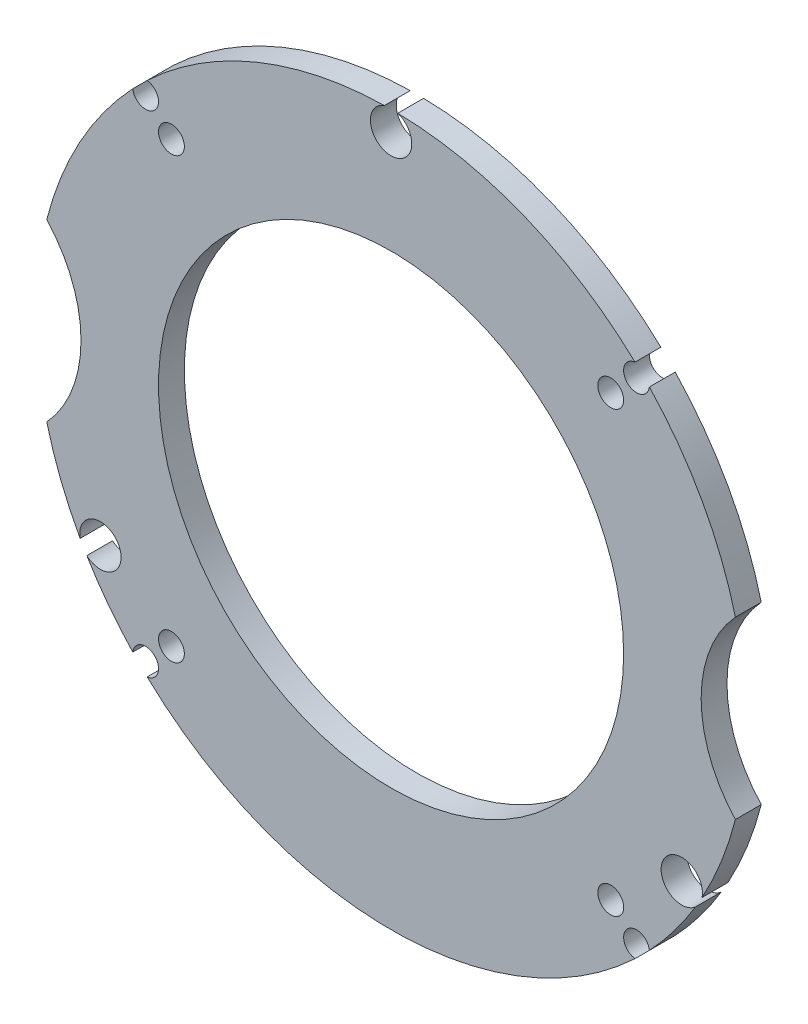
ISO-10303-21;
HEADER;
FILE_DESCRIPTION(('STEP AP214'),'2;1');
FILE_NAME('part.step','',(''),(''),'','','');
FILE_SCHEMA(('AUTOMOTIVE_DESIGN { 1 0 10303 214 1 1 1 1 }'));
ENDSEC;
DATA;
#1=APPLICATION_CONTEXT('core data for automotive mechanical design processes');
#2=APPLICATION_PROTOCOL_DEFINITION('international standard','automotive_design',2000,#1);
#3=PRODUCT_CONTEXT('',#1,'mechanical');
#4=PRODUCT('Part','Part','',(#3));
#5=PRODUCT_RELATED_PRODUCT_CATEGORY('part','',(#4));
#6=PRODUCT_DEFINITION_FORMATION('','',#4);
#7=PRODUCT_DEFINITION_CONTEXT('part definition',#1,'design');
#8=PRODUCT_DEFINITION('design','',#6,#7);
#9=PRODUCT_DEFINITION_SHAPE('','',#8);
#10=(LENGTH_UNIT() NAMED_UNIT(*) SI_UNIT(.MILLI.,.METRE.));
#11=(NAMED_UNIT(*) PLANE_ANGLE_UNIT() SI_UNIT($,.RADIAN.));
#12=(NAMED_UNIT(*) SI_UNIT($,.STERADIAN.) SOLID_ANGLE_UNIT());
#13=UNCERTAINTY_MEASURE_WITH_UNIT(LENGTH_MEASURE(1.E-05),#10,'distance_accuracy_value','');
#14=(GEOMETRIC_REPRESENTATION_CONTEXT(3) GLOBAL_UNCERTAINTY_ASSIGNED_CONTEXT((#13)) GLOBAL_UNIT_ASSIGNED_CONTEXT((#10,
#11,#12)) REPRESENTATION_CONTEXT('',''));
#15=CARTESIAN_POINT('',(0.,0.,0.));
#16=DIRECTION('',(0.,0.,1.));
#17=DIRECTION('',(1.,0.,0.));
#18=AXIS2_PLACEMENT_3D('',#15,#16,#17);
#19=CARTESIAN_POINT('',(0.,0.,2.));
#20=DIRECTION('',(0.,0.,-1.));
#21=DIRECTION('',(-1.,0.,0.));
#22=AXIS2_PLACEMENT_3D('',#19,#20,#21);
#23=CYLINDRICAL_SURFACE('',#22,27.5);
#24=DIRECTION('',(0.,0.,-1.));
#25=VECTOR('',#24,1.);
#26=CARTESIAN_POINT('',(26.6507352941176,-6.78146800352784,1.));
#27=LINE('',#26,#25);
#28=CARTESIAN_POINT('',(26.6507352941176,-6.78146800352784,2.));
#29=VERTEX_POINT('',#28);
#30=CARTESIAN_POINT('',(26.6507352941176,-6.78146800352783,0.));
#31=VERTEX_POINT('',#30);
#32=EDGE_CURVE('E48',#29,#31,#27,.T.);
#33=ORIENTED_EDGE('',*,*,#32,.F.);
#34=CARTESIAN_POINT('',(0.,0.,2.));
#35=DIRECTION('',(0.,0.,1.));
#36=DIRECTION('',(1.,0.,0.));
#37=AXIS2_PLACEMENT_3D('',#34,#35,#36);
#38=CIRCLE('',#37,27.5);
#39=CARTESIAN_POINT('',(24.0696780716224,-13.3003983973586,2.));
#40=VERTEX_POINT('',#39);
#41=EDGE_CURVE('E175',#40,#29,#38,.T.);
#42=ORIENTED_EDGE('',*,*,#41,.F.);
#43=DIRECTION('',(0.,0.,1.));
#44=VECTOR('',#43,1.);
#45=CARTESIAN_POINT('',(24.0696780716224,-13.3003983973586,1.));
#46=LINE('',#45,#44);
#47=CARTESIAN_POINT('',(24.0696780716224,-13.3003983973586,0.));
#48=VERTEX_POINT('',#47);
#49=EDGE_CURVE('E201',#40,#48,#46,.F.);
#50=ORIENTED_EDGE('',*,*,#49,.T.);
#51=CARTESIAN_POINT('',(0.,0.,0.));
#52=DIRECTION('',(0.,0.,1.));
#53=DIRECTION('',(1.,0.,0.));
#54=AXIS2_PLACEMENT_3D('',#51,#52,#53);
#55=CIRCLE('',#54,27.5);
#56=EDGE_CURVE('E214',#48,#31,#55,.T.);
#57=ORIENTED_EDGE('',*,*,#56,.T.);
#58=EDGE_LOOP('',(#33,#42,#50,#57));
#59=FACE_BOUND('',#58,.T.);
#60=ADVANCED_FACE('F33',(#59),#23,.T.);
#61=DIRECTION('',(0.,0.,-1.));
#62=VECTOR('',#61,1.);
#63=CARTESIAN_POINT('',(26.6507352941176,6.78146800352785,1.));
#64=LINE('',#63,#62);
#65=CARTESIAN_POINT('',(26.6507352941176,6.78146800352785,0.));
#66=VERTEX_POINT('',#65);
#67=CARTESIAN_POINT('',(26.6507352941176,6.78146800352785,2.));
#68=VERTEX_POINT('',#67);
#69=EDGE_CURVE('E155',#66,#68,#64,.F.);
#70=ORIENTED_EDGE('',*,*,#69,.F.);
#71=CARTESIAN_POINT('',(19.9930121510821,18.8819878489179,0.));
#72=VERTEX_POINT('',#71);
#73=EDGE_CURVE('E258',#66,#72,#55,.T.);
#74=ORIENTED_EDGE('',*,*,#73,.T.);
#75=DIRECTION('',(0.,0.,1.));
#76=VECTOR('',#75,1.);
#77=CARTESIAN_POINT('',(19.9930121510822,18.8819878489179,1.));
#78=LINE('',#77,#76);
#79=CARTESIAN_POINT('',(19.9930121510822,18.8819878489179,2.));
#80=VERTEX_POINT('',#79);
#81=EDGE_CURVE('E180',#72,#80,#78,.T.);
#82=ORIENTED_EDGE('',*,*,#81,.T.);
#83=EDGE_CURVE('E171',#68,#80,#38,.T.);
#84=ORIENTED_EDGE('',*,*,#83,.F.);
#85=EDGE_LOOP('',(#70,#74,#82,#84));
#86=FACE_BOUND('',#85,.T.);
#87=ADVANCED_FACE('F178',(#86),#23,.T.);
#88=DIRECTION('',(0.,0.,-1.));
#89=VECTOR('',#88,1.);
#90=CARTESIAN_POINT('',(-26.6507352941176,6.78146800352784,1.));
#91=LINE('',#90,#89);
#92=CARTESIAN_POINT('',(-26.6507352941176,6.78146800352784,2.));
#93=VERTEX_POINT('',#92);
#94=CARTESIAN_POINT('',(-26.6507352941176,6.78146800352784,0.));
#95=VERTEX_POINT('',#94);
#96=EDGE_CURVE('E55',#93,#95,#91,.T.);
#97=ORIENTED_EDGE('',*,*,#96,.F.);
#98=CARTESIAN_POINT('',(-19.9930121510822,18.8819878489179,2.));
#99=VERTEX_POINT('',#98);
#100=EDGE_CURVE('E187',#99,#93,#38,.T.);
#101=ORIENTED_EDGE('',*,*,#100,.F.);
#102=DIRECTION('',(0.,0.,1.));
#103=VECTOR('',#102,1.);
#104=CARTESIAN_POINT('',(-19.9930121510822,18.8819878489179,1.));
#105=LINE('',#104,#103);
#106=CARTESIAN_POINT('',(-19.9930121510822,18.8819878489179,0.));
#107=VERTEX_POINT('',#106);
#108=EDGE_CURVE('E340',#99,#107,#105,.F.);
#109=ORIENTED_EDGE('',*,*,#108,.T.);
#110=EDGE_CURVE('E247',#107,#95,#55,.T.);
#111=ORIENTED_EDGE('',*,*,#110,.T.);
#112=EDGE_LOOP('',(#97,#101,#109,#111));
#113=FACE_BOUND('',#112,.T.);
#114=ADVANCED_FACE('F353',(#113),#23,.T.);
#115=DIRECTION('',(0.,0.,-1.));
#116=VECTOR('',#115,1.);
#117=CARTESIAN_POINT('',(-26.6507352941176,-6.78146800352784,1.));
#118=LINE('',#117,#116);
#119=CARTESIAN_POINT('',(-26.6507352941176,-6.78146800352784,0.));
#120=VERTEX_POINT('',#119);
#121=CARTESIAN_POINT('',(-26.6507352941176,-6.78146800352784,2.));
#122=VERTEX_POINT('',#121);
#123=EDGE_CURVE('E345',#120,#122,#118,.F.);
#124=ORIENTED_EDGE('',*,*,#123,.F.);
#125=CARTESIAN_POINT('',(-24.0696780716224,-13.3003983973586,0.));
#126=VERTEX_POINT('',#125);
#127=EDGE_CURVE('E255',#120,#126,#55,.T.);
#128=ORIENTED_EDGE('',*,*,#127,.T.);
#129=DIRECTION('',(0.,0.,1.));
#130=VECTOR('',#129,1.);
#131=CARTESIAN_POINT('',(-24.0696780716224,-13.3003983973586,1.));
#132=LINE('',#131,#130);
#133=CARTESIAN_POINT('',(-24.0696780716224,-13.3003983973586,2.));
#134=VERTEX_POINT('',#133);
#135=EDGE_CURVE('E218',#126,#134,#132,.T.);
#136=ORIENTED_EDGE('',*,*,#135,.T.);
#137=EDGE_CURVE('E183',#122,#134,#38,.T.);
#138=ORIENTED_EDGE('',*,*,#137,.F.);
#139=EDGE_LOOP('',(#124,#128,#136,#138));
#140=FACE_BOUND('',#139,.T.);
#141=ADVANCED_FACE('F432',(#140),#23,.T.);
#142=CARTESIAN_POINT('',(-0.516356143244822,27.4951518696175,0.));
#143=VERTEX_POINT('',#142);
#144=CARTESIAN_POINT('',(-18.8819878489179,19.9930121510821,0.));
#145=VERTEX_POINT('',#144);
#146=EDGE_CURVE('E186',#143,#145,#55,.T.);
#147=ORIENTED_EDGE('',*,*,#146,.T.);
#148=DIRECTION('',(0.,0.,1.));
#149=VECTOR('',#148,1.);
#150=CARTESIAN_POINT('',(-18.8819878489179,19.9930121510822,1.));
#151=LINE('',#150,#149);
#152=CARTESIAN_POINT('',(-18.8819878489179,19.9930121510822,2.));
#153=VERTEX_POINT('',#152);
#154=EDGE_CURVE('E253',#145,#153,#151,.T.);
#155=ORIENTED_EDGE('',*,*,#154,.T.);
#156=CARTESIAN_POINT('',(-0.516356143244822,27.4951518696175,2.));
#157=VERTEX_POINT('',#156);
#158=EDGE_CURVE('E185',#157,#153,#38,.T.);
#159=ORIENTED_EDGE('',*,*,#158,.F.);
#160=DIRECTION('',(0.,0.,1.));
#161=VECTOR('',#160,1.);
#162=CARTESIAN_POINT('',(-0.516356143244816,27.4951518696176,1.));
#163=LINE('',#162,#161);
#164=EDGE_CURVE('E221',#157,#143,#163,.F.);
#165=ORIENTED_EDGE('',*,*,#164,.T.);
#166=EDGE_LOOP('',(#147,#155,#159,#165));
#167=FACE_BOUND('',#166,.T.);
#168=ADVANCED_FACE('F252',(#167),#23,.T.);
#169=CARTESIAN_POINT('',(-18.8819878489178,-19.9930121510822,0.));
#170=VERTEX_POINT('',#169);
#171=CARTESIAN_POINT('',(18.8819878489178,-19.9930121510822,0.));
#172=VERTEX_POINT('',#171);
#173=EDGE_CURVE('E260',#170,#172,#55,.T.);
#174=ORIENTED_EDGE('',*,*,#173,.T.);
#175=DIRECTION('',(0.,0.,1.));
#176=VECTOR('',#175,1.);
#177=CARTESIAN_POINT('',(18.8819878489179,-19.9930121510822,1.));
#178=LINE('',#177,#176);
#179=CARTESIAN_POINT('',(18.8819878489178,-19.9930121510822,2.));
#180=VERTEX_POINT('',#179);
#181=EDGE_CURVE('E236',#172,#180,#178,.T.);
#182=ORIENTED_EDGE('',*,*,#181,.T.);
#183=CARTESIAN_POINT('',(-18.8819878489178,-19.9930121510822,2.));
#184=VERTEX_POINT('',#183);
#185=EDGE_CURVE('E196',#184,#180,#38,.T.);
#186=ORIENTED_EDGE('',*,*,#185,.F.);
#187=DIRECTION('',(0.,0.,1.));
#188=VECTOR('',#187,1.);
#189=CARTESIAN_POINT('',(-18.8819878489179,-19.9930121510822,1.));
#190=LINE('',#189,#188);
#191=EDGE_CURVE('E227',#184,#170,#190,.F.);
#192=ORIENTED_EDGE('',*,*,#191,.T.);
#193=EDGE_LOOP('',(#174,#182,#186,#192));
#194=FACE_BOUND('',#193,.T.);
#195=ADVANCED_FACE('F387',(#194),#23,.T.);
#196=CARTESIAN_POINT('',(-23.5533219283776,-14.1947534722589,0.));
#197=VERTEX_POINT('',#196);
#198=CARTESIAN_POINT('',(-19.9930121510822,-18.8819878489178,0.));
#199=VERTEX_POINT('',#198);
#200=EDGE_CURVE('E254',#197,#199,#55,.T.);
#201=ORIENTED_EDGE('',*,*,#200,.T.);
#202=DIRECTION('',(0.,0.,1.));
#203=VECTOR('',#202,1.);
#204=CARTESIAN_POINT('',(-19.9930121510822,-18.8819878489179,1.));
#205=LINE('',#204,#203);
#206=CARTESIAN_POINT('',(-19.9930121510822,-18.8819878489178,2.));
#207=VERTEX_POINT('',#206);
#208=EDGE_CURVE('E230',#199,#207,#205,.T.);
#209=ORIENTED_EDGE('',*,*,#208,.T.);
#210=CARTESIAN_POINT('',(-23.5533219283776,-14.1947534722589,2.));
#211=VERTEX_POINT('',#210);
#212=EDGE_CURVE('E190',#211,#207,#38,.T.);
#213=ORIENTED_EDGE('',*,*,#212,.F.);
#214=DIRECTION('',(0.,0.,1.));
#215=VECTOR('',#214,1.);
#216=CARTESIAN_POINT('',(-23.5533219283776,-14.1947534722589,1.));
#217=LINE('',#216,#215);
#218=EDGE_CURVE('E212',#211,#197,#217,.F.);
#219=ORIENTED_EDGE('',*,*,#218,.T.);
#220=EDGE_LOOP('',(#201,#209,#213,#219));
#221=FACE_BOUND('',#220,.T.);
#222=ADVANCED_FACE('F381',(#221),#23,.T.);
#223=CARTESIAN_POINT('',(18.8819878489179,19.9930121510822,2.));
#224=VERTEX_POINT('',#223);
#225=CARTESIAN_POINT('',(0.516356143244828,27.4951518696175,2.));
#226=VERTEX_POINT('',#225);
#227=EDGE_CURVE('E181',#224,#226,#38,.T.);
#228=ORIENTED_EDGE('',*,*,#227,.F.);
#229=DIRECTION('',(0.,0.,1.));
#230=VECTOR('',#229,1.);
#231=CARTESIAN_POINT('',(18.8819878489179,19.9930121510822,1.));
#232=LINE('',#231,#230);
#233=CARTESIAN_POINT('',(18.8819878489179,19.9930121510822,0.));
#234=VERTEX_POINT('',#233);
#235=EDGE_CURVE('E320',#224,#234,#232,.F.);
#236=ORIENTED_EDGE('',*,*,#235,.T.);
#237=CARTESIAN_POINT('',(0.516356143244828,27.4951518696175,0.));
#238=VERTEX_POINT('',#237);
#239=EDGE_CURVE('E256',#234,#238,#55,.T.);
#240=ORIENTED_EDGE('',*,*,#239,.T.);
#241=DIRECTION('',(0.,0.,1.));
#242=VECTOR('',#241,1.);
#243=CARTESIAN_POINT('',(0.516356143244822,27.4951518696176,1.));
#244=LINE('',#243,#242);
#245=EDGE_CURVE('E224',#238,#226,#244,.T.);
#246=ORIENTED_EDGE('',*,*,#245,.T.);
#247=EDGE_LOOP('',(#228,#236,#240,#246));
#248=FACE_BOUND('',#247,.T.);
#249=ADVANCED_FACE('F372',(#248),#23,.T.);
#250=CARTESIAN_POINT('',(0.,0.,2.));
#251=DIRECTION('',(0.,0.,1.));
#252=DIRECTION('',(1.,0.,0.));
#253=AXIS2_PLACEMENT_3D('',#250,#251,#252);
#254=PLANE('',#253);
#255=ORIENTED_EDGE('',*,*,#100,.T.);
#256=CARTESIAN_POINT('',(-34.,0.,2.));
#257=DIRECTION('',(0.,0.,1.));
#258=DIRECTION('',(1.,0.,0.));
#259=AXIS2_PLACEMENT_3D('',#256,#257,#258);
#260=CIRCLE('',#259,10.);
#261=EDGE_CURVE('E163',#122,#93,#260,.T.);
#262=ORIENTED_EDGE('',*,*,#261,.F.);
#263=ORIENTED_EDGE('',*,*,#137,.T.);
#264=CARTESIAN_POINT('',(-22.5,-12.9903810567666,2.));
#265=DIRECTION('',(0.,0.,1.));
#266=DIRECTION('',(1.,0.,0.));
#267=AXIS2_PLACEMENT_3D('',#264,#265,#266);
#268=CIRCLE('',#267,1.6);
#269=EDGE_CURVE('E289',#211,#134,#268,.T.);
#270=ORIENTED_EDGE('',*,*,#269,.F.);
#271=ORIENTED_EDGE('',*,*,#212,.T.);
#272=CARTESIAN_POINT('',(-19.,-19.,2.));
#273=DIRECTION('',(0.,0.,1.));
#274=DIRECTION('',(1.,0.,0.));
#275=AXIS2_PLACEMENT_3D('',#272,#273,#274);
#276=CIRCLE('',#275,0.999999999999987);
#277=EDGE_CURVE('E306',#184,#207,#276,.T.);
#278=ORIENTED_EDGE('',*,*,#277,.F.);
#279=ORIENTED_EDGE('',*,*,#185,.T.);
#280=CARTESIAN_POINT('',(19.,-19.,2.));
#281=DIRECTION('',(0.,0.,1.));
#282=DIRECTION('',(1.,0.,0.));
#283=AXIS2_PLACEMENT_3D('',#280,#281,#282);
#284=CIRCLE('',#283,0.999999999999987);
#285=CARTESIAN_POINT('',(19.9930121510822,-18.8819878489178,2.));
#286=VERTEX_POINT('',#285);
#287=EDGE_CURVE('E311',#286,#180,#284,.T.);
#288=ORIENTED_EDGE('',*,*,#287,.F.);
#289=CARTESIAN_POINT('',(23.5533219283776,-14.1947534722589,2.));
#290=VERTEX_POINT('',#289);
#291=EDGE_CURVE('E184',#286,#290,#38,.T.);
#292=ORIENTED_EDGE('',*,*,#291,.T.);
#293=CARTESIAN_POINT('',(22.5,-12.9903810567666,2.));
#294=DIRECTION('',(0.,0.,1.));
#295=DIRECTION('',(1.,0.,0.));
#296=AXIS2_PLACEMENT_3D('',#293,#294,#295);
#297=CIRCLE('',#296,1.6);
#298=EDGE_CURVE('E282',#40,#290,#297,.T.);
#299=ORIENTED_EDGE('',*,*,#298,.F.);
#300=ORIENTED_EDGE('',*,*,#41,.T.);
#301=CARTESIAN_POINT('',(34.,0.,2.));
#302=DIRECTION('',(0.,0.,1.));
#303=DIRECTION('',(1.,0.,0.));
#304=AXIS2_PLACEMENT_3D('',#301,#302,#303);
#305=CIRCLE('',#304,10.);
#306=EDGE_CURVE('E158',#68,#29,#305,.T.);
#307=ORIENTED_EDGE('',*,*,#306,.F.);
#308=ORIENTED_EDGE('',*,*,#83,.T.);
#309=CARTESIAN_POINT('',(19.,19.,2.));
#310=DIRECTION('',(0.,0.,1.));
#311=DIRECTION('',(1.,0.,0.));
#312=AXIS2_PLACEMENT_3D('',#309,#310,#311);
#313=CIRCLE('',#312,0.999999999999987);
#314=EDGE_CURVE('E325',#224,#80,#313,.T.);
#315=ORIENTED_EDGE('',*,*,#314,.F.);
#316=ORIENTED_EDGE('',*,*,#227,.T.);
#317=CARTESIAN_POINT('',(0.,25.9807621135332,2.));
#318=DIRECTION('',(0.,0.,1.));
#319=DIRECTION('',(1.,0.,0.));
#320=AXIS2_PLACEMENT_3D('',#317,#318,#319);
#321=CIRCLE('',#320,1.6);
#322=EDGE_CURVE('E294',#157,#226,#321,.T.);
#323=ORIENTED_EDGE('',*,*,#322,.F.);
#324=ORIENTED_EDGE('',*,*,#158,.T.);
#325=CARTESIAN_POINT('',(-19.,19.,2.));
#326=DIRECTION('',(0.,0.,1.));
#327=DIRECTION('',(1.,0.,0.));
#328=AXIS2_PLACEMENT_3D('',#325,#326,#327);
#329=CIRCLE('',#328,0.999999999999987);
#330=EDGE_CURVE('E342',#99,#153,#329,.T.);
#331=ORIENTED_EDGE('',*,*,#330,.F.);
#332=EDGE_LOOP('',(#255,#262,#263,#270,#271,#278,#279,#288,#292,#299,#300,#307,#308,#315,#316,
#323,#324,#331));
#333=FACE_BOUND('',#332,.T.);
#334=CARTESIAN_POINT('',(-17.,17.,2.));
#335=DIRECTION('',(0.,0.,1.));
#336=DIRECTION('',(1.,0.,0.));
#337=AXIS2_PLACEMENT_3D('',#334,#335,#336);
#338=CIRCLE('',#337,0.999999999999987);
#339=CARTESIAN_POINT('',(-16.,17.,2.));
#340=VERTEX_POINT('',#339);
#341=EDGE_CURVE('E336',#340,#340,#338,.T.);
#342=ORIENTED_EDGE('',*,*,#341,.F.);
#343=EDGE_LOOP('',(#342));
#344=FACE_BOUND('',#343,.T.);
#345=CARTESIAN_POINT('',(17.,17.,2.));
#346=DIRECTION('',(0.,0.,1.));
#347=DIRECTION('',(1.,0.,0.));
#348=AXIS2_PLACEMENT_3D('',#345,#346,#347);
#349=CIRCLE('',#348,0.999999999999987);
#350=CARTESIAN_POINT('',(18.,17.,2.));
#351=VERTEX_POINT('',#350);
#352=EDGE_CURVE('E330',#351,#351,#349,.T.);
#353=ORIENTED_EDGE('',*,*,#352,.F.);
#354=EDGE_LOOP('',(#353));
#355=FACE_BOUND('',#354,.T.);
#356=CARTESIAN_POINT('',(17.,-17.,2.));
#357=DIRECTION('',(0.,0.,1.));
#358=DIRECTION('',(1.,0.,0.));
#359=AXIS2_PLACEMENT_3D('',#356,#357,#358);
#360=CIRCLE('',#359,0.999999999999987);
#361=CARTESIAN_POINT('',(18.,-17.,2.));
#362=VERTEX_POINT('',#361);
#363=EDGE_CURVE('E316',#362,#362,#360,.T.);
#364=ORIENTED_EDGE('',*,*,#363,.F.);
#365=EDGE_LOOP('',(#364));
#366=FACE_BOUND('',#365,.T.);
#367=CARTESIAN_POINT('',(-17.,-17.,2.));
#368=DIRECTION('',(0.,0.,1.));
#369=DIRECTION('',(1.,0.,0.));
#370=AXIS2_PLACEMENT_3D('',#367,#368,#369);
#371=CIRCLE('',#370,0.999999999999987);
#372=CARTESIAN_POINT('',(-16.,-17.,2.));
#373=VERTEX_POINT('',#372);
#374=EDGE_CURVE('E300',#373,#373,#371,.T.);
#375=ORIENTED_EDGE('',*,*,#374,.F.);
#376=EDGE_LOOP('',(#375));
#377=FACE_BOUND('',#376,.T.);
#378=CARTESIAN_POINT('',(0.,0.,2.));
#379=DIRECTION('',(0.,0.,1.));
#380=DIRECTION('',(1.,0.,0.));
#381=AXIS2_PLACEMENT_3D('',#378,#379,#380);
#382=CIRCLE('',#381,18.);
#383=CARTESIAN_POINT('',(18.,0.,2.));
#384=VERTEX_POINT('',#383);
#385=EDGE_CURVE('E269',#384,#384,#382,.T.);
#386=ORIENTED_EDGE('',*,*,#385,.F.);
#387=EDGE_LOOP('',(#386));
#388=FACE_BOUND('',#387,.T.);
#389=ADVANCED_FACE('F168',(#333,#344,#355,#366,#377,#388),#254,.T.);
#390=CARTESIAN_POINT('',(0.,0.,0.));
#391=DIRECTION('',(0.,0.,1.));
#392=DIRECTION('',(1.,0.,0.));
#393=AXIS2_PLACEMENT_3D('',#390,#391,#392);
#394=PLANE('',#393);
#395=CARTESIAN_POINT('',(-34.,0.,0.));
#396=DIRECTION('',(0.,0.,1.));
#397=DIRECTION('',(1.,0.,0.));
#398=AXIS2_PLACEMENT_3D('',#395,#396,#397);
#399=CIRCLE('',#398,10.);
#400=EDGE_CURVE('E11',#95,#120,#399,.F.);
#401=ORIENTED_EDGE('',*,*,#400,.F.);
#402=ORIENTED_EDGE('',*,*,#110,.F.);
#403=CARTESIAN_POINT('',(-19.,19.,0.));
#404=DIRECTION('',(0.,0.,1.));
#405=DIRECTION('',(1.,0.,0.));
#406=AXIS2_PLACEMENT_3D('',#403,#404,#405);
#407=CIRCLE('',#406,0.999999999999994);
#408=EDGE_CURVE('E41',#107,#145,#407,.T.);
#409=ORIENTED_EDGE('',*,*,#408,.T.);
#410=ORIENTED_EDGE('',*,*,#146,.F.);
#411=CARTESIAN_POINT('',(0.,25.9807621135332,0.));
#412=DIRECTION('',(0.,0.,1.));
#413=DIRECTION('',(1.,0.,0.));
#414=AXIS2_PLACEMENT_3D('',#411,#412,#413);
#415=CIRCLE('',#414,1.6);
#416=EDGE_CURVE('E280',#143,#238,#415,.T.);
#417=ORIENTED_EDGE('',*,*,#416,.T.);
#418=ORIENTED_EDGE('',*,*,#239,.F.);
#419=CARTESIAN_POINT('',(19.,19.,0.));
#420=DIRECTION('',(0.,0.,1.));
#421=DIRECTION('',(1.,0.,0.));
#422=AXIS2_PLACEMENT_3D('',#419,#420,#421);
#423=CIRCLE('',#422,1.);
#424=EDGE_CURVE('E322',#234,#72,#423,.T.);
#425=ORIENTED_EDGE('',*,*,#424,.T.);
#426=ORIENTED_EDGE('',*,*,#73,.F.);
#427=CARTESIAN_POINT('',(34.,0.,0.));
#428=DIRECTION('',(0.,0.,1.));
#429=DIRECTION('',(1.,0.,0.));
#430=AXIS2_PLACEMENT_3D('',#427,#428,#429);
#431=CIRCLE('',#430,10.);
#432=EDGE_CURVE('E159',#66,#31,#431,.T.);
#433=ORIENTED_EDGE('',*,*,#432,.T.);
#434=ORIENTED_EDGE('',*,*,#56,.F.);
#435=CARTESIAN_POINT('',(22.5,-12.9903810567666,0.));
#436=DIRECTION('',(0.,0.,1.));
#437=DIRECTION('',(1.,0.,0.));
#438=AXIS2_PLACEMENT_3D('',#435,#436,#437);
#439=CIRCLE('',#438,1.6);
#440=CARTESIAN_POINT('',(23.5533219283776,-14.1947534722589,0.));
#441=VERTEX_POINT('',#440);
#442=EDGE_CURVE('E285',#48,#441,#439,.T.);
#443=ORIENTED_EDGE('',*,*,#442,.T.);
#444=CARTESIAN_POINT('',(19.9930121510822,-18.8819878489178,0.));
#445=VERTEX_POINT('',#444);
#446=EDGE_CURVE('E257',#445,#441,#55,.T.);
#447=ORIENTED_EDGE('',*,*,#446,.F.);
#448=CARTESIAN_POINT('',(19.,-19.,0.));
#449=DIRECTION('',(0.,0.,1.));
#450=DIRECTION('',(1.,0.,0.));
#451=AXIS2_PLACEMENT_3D('',#448,#449,#450);
#452=CIRCLE('',#451,1.);
#453=EDGE_CURVE('E308',#445,#172,#452,.T.);
#454=ORIENTED_EDGE('',*,*,#453,.T.);
#455=ORIENTED_EDGE('',*,*,#173,.F.);
#456=CARTESIAN_POINT('',(-19.,-19.,0.));
#457=DIRECTION('',(0.,0.,1.));
#458=DIRECTION('',(1.,0.,0.));
#459=AXIS2_PLACEMENT_3D('',#456,#457,#458);
#460=CIRCLE('',#459,1.);
#461=EDGE_CURVE('E303',#170,#199,#460,.T.);
#462=ORIENTED_EDGE('',*,*,#461,.T.);
#463=ORIENTED_EDGE('',*,*,#200,.F.);
#464=CARTESIAN_POINT('',(-22.5,-12.9903810567666,0.));
#465=DIRECTION('',(0.,0.,1.));
#466=DIRECTION('',(1.,0.,0.));
#467=AXIS2_PLACEMENT_3D('',#464,#465,#466);
#468=CIRCLE('',#467,1.6);
#469=EDGE_CURVE('E291',#197,#126,#468,.T.);
#470=ORIENTED_EDGE('',*,*,#469,.T.);
#471=ORIENTED_EDGE('',*,*,#127,.F.);
#472=EDGE_LOOP('',(#401,#402,#409,#410,#417,#418,#425,#426,#433,#434,#443,#447,#454,#455,#462,
#463,#470,#471));
#473=FACE_BOUND('',#472,.T.);
#474=CARTESIAN_POINT('',(-17.,17.,0.));
#475=DIRECTION('',(0.,0.,1.));
#476=DIRECTION('',(1.,0.,0.));
#477=AXIS2_PLACEMENT_3D('',#474,#475,#476);
#478=CIRCLE('',#477,1.);
#479=CARTESIAN_POINT('',(-16.,17.,0.));
#480=VERTEX_POINT('',#479);
#481=EDGE_CURVE('E333',#480,#480,#478,.T.);
#482=ORIENTED_EDGE('',*,*,#481,.T.);
#483=EDGE_LOOP('',(#482));
#484=FACE_BOUND('',#483,.T.);
#485=CARTESIAN_POINT('',(17.,17.,0.));
#486=DIRECTION('',(0.,0.,1.));
#487=DIRECTION('',(1.,0.,0.));
#488=AXIS2_PLACEMENT_3D('',#485,#486,#487);
#489=CIRCLE('',#488,1.);
#490=CARTESIAN_POINT('',(18.,17.,0.));
#491=VERTEX_POINT('',#490);
#492=EDGE_CURVE('E327',#491,#491,#489,.T.);
#493=ORIENTED_EDGE('',*,*,#492,.T.);
#494=EDGE_LOOP('',(#493));
#495=FACE_BOUND('',#494,.T.);
#496=CARTESIAN_POINT('',(17.,-17.,0.));
#497=DIRECTION('',(0.,0.,1.));
#498=DIRECTION('',(1.,0.,0.));
#499=AXIS2_PLACEMENT_3D('',#496,#497,#498);
#500=CIRCLE('',#499,1.);
#501=CARTESIAN_POINT('',(18.,-17.,0.));
#502=VERTEX_POINT('',#501);
#503=EDGE_CURVE('E313',#502,#502,#500,.T.);
#504=ORIENTED_EDGE('',*,*,#503,.T.);
#505=EDGE_LOOP('',(#504));
#506=FACE_BOUND('',#505,.T.);
#507=CARTESIAN_POINT('',(-17.,-17.,0.));
#508=DIRECTION('',(0.,0.,1.));
#509=DIRECTION('',(1.,0.,0.));
#510=AXIS2_PLACEMENT_3D('',#507,#508,#509);
#511=CIRCLE('',#510,1.);
#512=CARTESIAN_POINT('',(-16.,-17.,0.));
#513=VERTEX_POINT('',#512);
#514=EDGE_CURVE('E286',#513,#513,#511,.T.);
#515=ORIENTED_EDGE('',*,*,#514,.T.);
#516=EDGE_LOOP('',(#515));
#517=FACE_BOUND('',#516,.T.);
#518=CARTESIAN_POINT('',(0.,0.,0.));
#519=DIRECTION('',(0.,0.,1.));
#520=DIRECTION('',(1.,0.,0.));
#521=AXIS2_PLACEMENT_3D('',#518,#519,#520);
#522=CIRCLE('',#521,18.);
#523=CARTESIAN_POINT('',(18.,0.,0.));
#524=VERTEX_POINT('',#523);
#525=EDGE_CURVE('E275',#524,#524,#522,.T.);
#526=ORIENTED_EDGE('',*,*,#525,.T.);
#527=EDGE_LOOP('',(#526));
#528=FACE_BOUND('',#527,.T.);
#529=ADVANCED_FACE('F243',(#473,#484,#495,#506,#517,#528),#394,.F.);
#530=ORIENTED_EDGE('',*,*,#291,.F.);
#531=DIRECTION('',(0.,0.,1.));
#532=VECTOR('',#531,1.);
#533=CARTESIAN_POINT('',(19.9930121510822,-18.8819878489179,1.));
#534=LINE('',#533,#532);
#535=EDGE_CURVE('E233',#286,#445,#534,.F.);
#536=ORIENTED_EDGE('',*,*,#535,.T.);
#537=ORIENTED_EDGE('',*,*,#446,.T.);
#538=DIRECTION('',(0.,0.,1.));
#539=VECTOR('',#538,1.);
#540=CARTESIAN_POINT('',(23.5533219283776,-14.1947534722589,1.));
#541=LINE('',#540,#539);
#542=EDGE_CURVE('E206',#441,#290,#541,.T.);
#543=ORIENTED_EDGE('',*,*,#542,.T.);
#544=EDGE_LOOP('',(#530,#536,#537,#543));
#545=FACE_BOUND('',#544,.T.);
#546=ADVANCED_FACE('F35',(#545),#23,.T.);
#547=CARTESIAN_POINT('',(0.,0.,2.));
#548=DIRECTION('',(0.,0.,-1.));
#549=DIRECTION('',(-1.,0.,0.));
#550=AXIS2_PLACEMENT_3D('',#547,#548,#549);
#551=CYLINDRICAL_SURFACE('',#550,18.);
#552=ORIENTED_EDGE('',*,*,#385,.T.);
#553=EDGE_LOOP('',(#552));
#554=FACE_BOUND('',#553,.T.);
#555=ORIENTED_EDGE('',*,*,#525,.F.);
#556=EDGE_LOOP('',(#555));
#557=FACE_BOUND('',#556,.T.);
#558=ADVANCED_FACE('F371',(#554,#557),#551,.F.);
#559=CARTESIAN_POINT('',(22.5,-12.9903810567666,0.));
#560=DIRECTION('',(0.,0.,1.));
#561=DIRECTION('',(1.,0.,0.));
#562=AXIS2_PLACEMENT_3D('',#559,#560,#561);
#563=CYLINDRICAL_SURFACE('',#562,1.6);
#564=ORIENTED_EDGE('',*,*,#442,.F.);
#565=ORIENTED_EDGE('',*,*,#49,.F.);
#566=ORIENTED_EDGE('',*,*,#298,.T.);
#567=ORIENTED_EDGE('',*,*,#542,.F.);
#568=EDGE_LOOP('',(#564,#565,#566,#567));
#569=FACE_BOUND('',#568,.T.);
#570=ADVANCED_FACE('F377',(#569),#563,.F.);
#571=CARTESIAN_POINT('',(-22.5,-12.9903810567666,0.));
#572=DIRECTION('',(0.,0.,1.));
#573=DIRECTION('',(1.,0.,0.));
#574=AXIS2_PLACEMENT_3D('',#571,#572,#573);
#575=CYLINDRICAL_SURFACE('',#574,1.6);
#576=ORIENTED_EDGE('',*,*,#469,.F.);
#577=ORIENTED_EDGE('',*,*,#218,.F.);
#578=ORIENTED_EDGE('',*,*,#269,.T.);
#579=ORIENTED_EDGE('',*,*,#135,.F.);
#580=EDGE_LOOP('',(#576,#577,#578,#579));
#581=FACE_BOUND('',#580,.T.);
#582=ADVANCED_FACE('F419',(#581),#575,.F.);
#583=CARTESIAN_POINT('',(0.,25.9807621135332,0.));
#584=DIRECTION('',(0.,0.,1.));
#585=DIRECTION('',(1.,0.,0.));
#586=AXIS2_PLACEMENT_3D('',#583,#584,#585);
#587=CYLINDRICAL_SURFACE('',#586,1.6);
#588=ORIENTED_EDGE('',*,*,#416,.F.);
#589=ORIENTED_EDGE('',*,*,#164,.F.);
#590=ORIENTED_EDGE('',*,*,#322,.T.);
#591=ORIENTED_EDGE('',*,*,#245,.F.);
#592=EDGE_LOOP('',(#588,#589,#590,#591));
#593=FACE_BOUND('',#592,.T.);
#594=ADVANCED_FACE('F390',(#593),#587,.F.);
#595=CARTESIAN_POINT('',(-17.,-17.,2.));
#596=DIRECTION('',(0.,0.,1.));
#597=DIRECTION('',(1.,0.,0.));
#598=AXIS2_PLACEMENT_3D('',#595,#596,#597);
#599=CYLINDRICAL_SURFACE('',#598,0.999999999999994);
#600=ORIENTED_EDGE('',*,*,#514,.F.);
#601=EDGE_LOOP('',(#600));
#602=FACE_BOUND('',#601,.T.);
#603=ORIENTED_EDGE('',*,*,#374,.T.);
#604=EDGE_LOOP('',(#603));
#605=FACE_BOUND('',#604,.T.);
#606=ADVANCED_FACE('F412',(#602,#605),#599,.F.);
#607=CARTESIAN_POINT('',(-19.,-19.,2.));
#608=DIRECTION('',(0.,0.,1.));
#609=DIRECTION('',(1.,0.,0.));
#610=AXIS2_PLACEMENT_3D('',#607,#608,#609);
#611=CYLINDRICAL_SURFACE('',#610,0.999999999999994);
#612=ORIENTED_EDGE('',*,*,#461,.F.);
#613=ORIENTED_EDGE('',*,*,#191,.F.);
#614=ORIENTED_EDGE('',*,*,#277,.T.);
#615=ORIENTED_EDGE('',*,*,#208,.F.);
#616=EDGE_LOOP('',(#612,#613,#614,#615));
#617=FACE_BOUND('',#616,.T.);
#618=ADVANCED_FACE('F408',(#617),#611,.F.);
#619=CARTESIAN_POINT('',(19.,-19.,2.));
#620=DIRECTION('',(0.,0.,1.));
#621=DIRECTION('',(1.,0.,0.));
#622=AXIS2_PLACEMENT_3D('',#619,#620,#621);
#623=CYLINDRICAL_SURFACE('',#622,0.999999999999994);
#624=ORIENTED_EDGE('',*,*,#453,.F.);
#625=ORIENTED_EDGE('',*,*,#535,.F.);
#626=ORIENTED_EDGE('',*,*,#287,.T.);
#627=ORIENTED_EDGE('',*,*,#181,.F.);
#628=EDGE_LOOP('',(#624,#625,#626,#627));
#629=FACE_BOUND('',#628,.T.);
#630=ADVANCED_FACE('F402',(#629),#623,.F.);
#631=CARTESIAN_POINT('',(17.,-17.,2.));
#632=DIRECTION('',(0.,0.,1.));
#633=DIRECTION('',(1.,0.,0.));
#634=AXIS2_PLACEMENT_3D('',#631,#632,#633);
#635=CYLINDRICAL_SURFACE('',#634,0.999999999999994);
#636=ORIENTED_EDGE('',*,*,#503,.F.);
#637=EDGE_LOOP('',(#636));
#638=FACE_BOUND('',#637,.T.);
#639=ORIENTED_EDGE('',*,*,#363,.T.);
#640=EDGE_LOOP('',(#639));
#641=FACE_BOUND('',#640,.T.);
#642=ADVANCED_FACE('F394',(#638,#641),#635,.F.);
#643=CARTESIAN_POINT('',(19.,19.,2.));
#644=DIRECTION('',(0.,0.,1.));
#645=DIRECTION('',(1.,0.,0.));
#646=AXIS2_PLACEMENT_3D('',#643,#644,#645);
#647=CYLINDRICAL_SURFACE('',#646,0.999999999999994);
#648=ORIENTED_EDGE('',*,*,#424,.F.);
#649=ORIENTED_EDGE('',*,*,#235,.F.);
#650=ORIENTED_EDGE('',*,*,#314,.T.);
#651=ORIENTED_EDGE('',*,*,#81,.F.);
#652=EDGE_LOOP('',(#648,#649,#650,#651));
#653=FACE_BOUND('',#652,.T.);
#654=ADVANCED_FACE('F392',(#653),#647,.F.);
#655=CARTESIAN_POINT('',(17.,17.,2.));
#656=DIRECTION('',(0.,0.,1.));
#657=DIRECTION('',(1.,0.,0.));
#658=AXIS2_PLACEMENT_3D('',#655,#656,#657);
#659=CYLINDRICAL_SURFACE('',#658,0.999999999999994);
#660=ORIENTED_EDGE('',*,*,#492,.F.);
#661=EDGE_LOOP('',(#660));
#662=FACE_BOUND('',#661,.T.);
#663=ORIENTED_EDGE('',*,*,#352,.T.);
#664=EDGE_LOOP('',(#663));
#665=FACE_BOUND('',#664,.T.);
#666=ADVANCED_FACE('F363',(#662,#665),#659,.F.);
#667=CARTESIAN_POINT('',(-17.,17.,2.));
#668=DIRECTION('',(0.,0.,1.));
#669=DIRECTION('',(1.,0.,0.));
#670=AXIS2_PLACEMENT_3D('',#667,#668,#669);
#671=CYLINDRICAL_SURFACE('',#670,0.999999999999994);
#672=ORIENTED_EDGE('',*,*,#481,.F.);
#673=EDGE_LOOP('',(#672));
#674=FACE_BOUND('',#673,.T.);
#675=ORIENTED_EDGE('',*,*,#341,.T.);
#676=EDGE_LOOP('',(#675));
#677=FACE_BOUND('',#676,.T.);
#678=ADVANCED_FACE('F356',(#674,#677),#671,.F.);
#679=CARTESIAN_POINT('',(-19.,19.,2.));
#680=DIRECTION('',(0.,0.,1.));
#681=DIRECTION('',(1.,0.,0.));
#682=AXIS2_PLACEMENT_3D('',#679,#680,#681);
#683=CYLINDRICAL_SURFACE('',#682,0.999999999999994);
#684=ORIENTED_EDGE('',*,*,#408,.F.);
#685=ORIENTED_EDGE('',*,*,#108,.F.);
#686=ORIENTED_EDGE('',*,*,#330,.T.);
#687=ORIENTED_EDGE('',*,*,#154,.F.);
#688=EDGE_LOOP('',(#684,#685,#686,#687));
#689=FACE_BOUND('',#688,.T.);
#690=ADVANCED_FACE('F354',(#689),#683,.F.);
#691=CARTESIAN_POINT('',(34.,0.,2.));
#692=DIRECTION('',(0.,0.,-1.));
#693=DIRECTION('',(-1.,0.,0.));
#694=AXIS2_PLACEMENT_3D('',#691,#692,#693);
#695=CYLINDRICAL_SURFACE('',#694,10.);
#696=ORIENTED_EDGE('',*,*,#32,.T.);
#697=ORIENTED_EDGE('',*,*,#432,.F.);
#698=ORIENTED_EDGE('',*,*,#69,.T.);
#699=ORIENTED_EDGE('',*,*,#306,.T.);
#700=EDGE_LOOP('',(#696,#697,#698,#699));
#701=FACE_BOUND('',#700,.T.);
#702=ADVANCED_FACE('F157',(#701),#695,.F.);
#703=CARTESIAN_POINT('',(-34.,0.,2.));
#704=DIRECTION('',(0.,0.,-1.));
#705=DIRECTION('',(-1.,0.,0.));
#706=AXIS2_PLACEMENT_3D('',#703,#704,#705);
#707=CYLINDRICAL_SURFACE('',#706,10.);
#708=ORIENTED_EDGE('',*,*,#96,.T.);
#709=ORIENTED_EDGE('',*,*,#400,.T.);
#710=ORIENTED_EDGE('',*,*,#123,.T.);
#711=ORIENTED_EDGE('',*,*,#261,.T.);
#712=EDGE_LOOP('',(#708,#709,#710,#711));
#713=FACE_BOUND('',#712,.T.);
#714=ADVANCED_FACE('F349',(#713),#707,.F.);
#715=CLOSED_SHELL('',(#60,#87,#114,#141,#168,#195,#222,#249,#389,#529,#546,#558,#570,#582,#594,
#606,#618,#630,#642,#654,#666,#678,#690,#702,#714));
#716=MANIFOLD_SOLID_BREP('B2',#715);
#717=ADVANCED_BREP_SHAPE_REPRESENTATION('',(#18,#716),#14);
#718=SHAPE_DEFINITION_REPRESENTATION(#9,#717);
ENDSEC;
END-ISO-10303-21;
